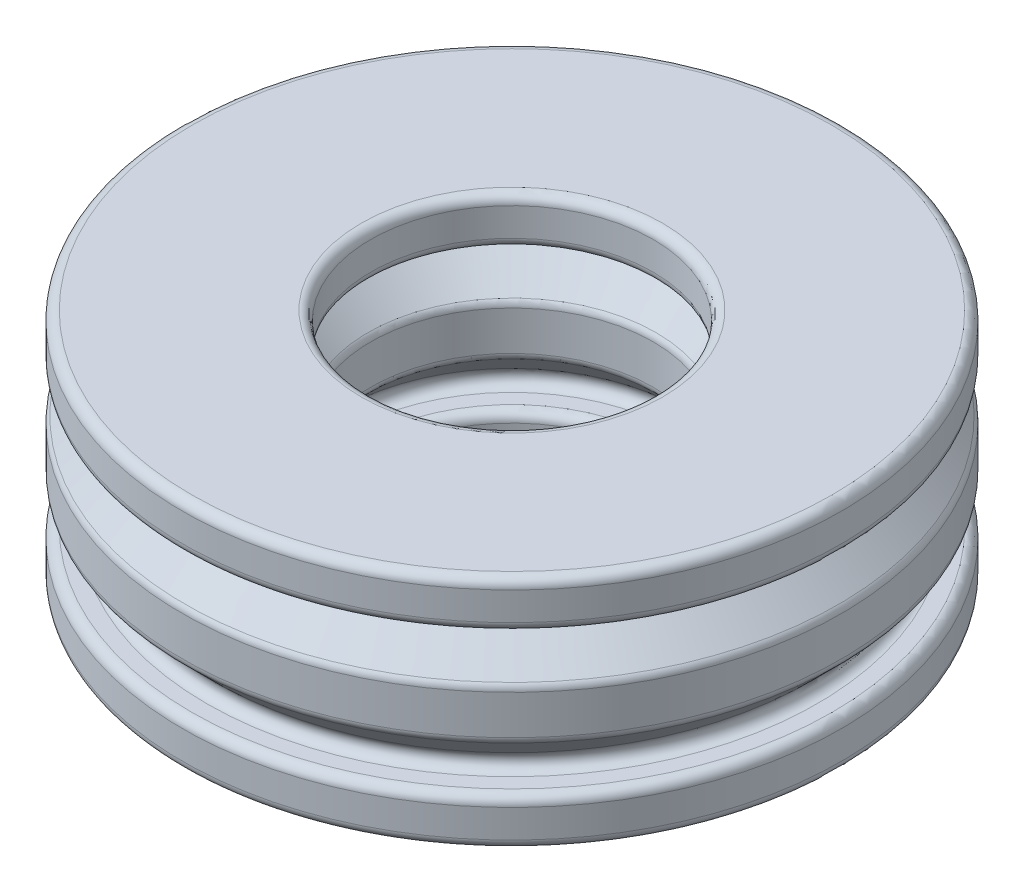
ISO-10303-21;
HEADER;
FILE_DESCRIPTION(('STEP AP214'),'2;1');
FILE_NAME('part.step','',(''),(''),'','','');
FILE_SCHEMA(('AUTOMOTIVE_DESIGN { 1 0 10303 214 1 1 1 1 }'));
ENDSEC;
DATA;
#1=APPLICATION_CONTEXT('core data for automotive mechanical design processes');
#2=APPLICATION_PROTOCOL_DEFINITION('international standard','automotive_design',2000,#1);
#3=PRODUCT_CONTEXT('',#1,'mechanical');
#4=PRODUCT('Part','Part','',(#3));
#5=PRODUCT_RELATED_PRODUCT_CATEGORY('part','',(#4));
#6=PRODUCT_DEFINITION_FORMATION('','',#4);
#7=PRODUCT_DEFINITION_CONTEXT('part definition',#1,'design');
#8=PRODUCT_DEFINITION('design','',#6,#7);
#9=PRODUCT_DEFINITION_SHAPE('','',#8);
#10=(LENGTH_UNIT() NAMED_UNIT(*) SI_UNIT(.MILLI.,.METRE.));
#11=(NAMED_UNIT(*) PLANE_ANGLE_UNIT() SI_UNIT($,.RADIAN.));
#12=(NAMED_UNIT(*) SI_UNIT($,.STERADIAN.) SOLID_ANGLE_UNIT());
#13=UNCERTAINTY_MEASURE_WITH_UNIT(LENGTH_MEASURE(1.E-05),#10,'distance_accuracy_value','');
#14=(GEOMETRIC_REPRESENTATION_CONTEXT(3) GLOBAL_UNCERTAINTY_ASSIGNED_CONTEXT((#13)) GLOBAL_UNIT_ASSIGNED_CONTEXT((#10,
#11,#12)) REPRESENTATION_CONTEXT('',''));
#15=CARTESIAN_POINT('',(0.,0.,0.));
#16=DIRECTION('',(0.,0.,1.));
#17=DIRECTION('',(1.,0.,0.));
#18=AXIS2_PLACEMENT_3D('',#15,#16,#17);
#19=CARTESIAN_POINT('',(0.,2.08284271247461,0.));
#20=DIRECTION('',(0.,-1.,0.));
#21=DIRECTION('',(0.,0.,-1.));
#22=AXIS2_PLACEMENT_3D('',#19,#20,#21);
#23=TOROIDAL_SURFACE('',#22,3.2,0.2);
#24=CARTESIAN_POINT('',(0.,2.08284271247461,0.));
#25=DIRECTION('',(0.,-1.,0.));
#26=DIRECTION('',(0.,0.,-1.));
#27=AXIS2_PLACEMENT_3D('',#24,#25,#26);
#28=CIRCLE('',#27,3.);
#29=CARTESIAN_POINT('',(0.,2.08284271247461,-3.));
#30=VERTEX_POINT('',#29);
#31=EDGE_CURVE('E10',#30,#30,#28,.T.);
#32=ORIENTED_EDGE('',*,*,#31,.F.);
#33=EDGE_LOOP('',(#32));
#34=FACE_BOUND('',#33,.T.);
#35=CARTESIAN_POINT('',(0.,1.9414213562373,0.));
#36=DIRECTION('',(0.,-1.,0.));
#37=DIRECTION('',(0.,0.,-1.));
#38=AXIS2_PLACEMENT_3D('',#35,#36,#37);
#39=CIRCLE('',#38,3.05857864376269);
#40=CARTESIAN_POINT('',(0.,1.9414213562373,-3.05857864376269));
#41=VERTEX_POINT('',#40);
#42=EDGE_CURVE('E134',#41,#41,#39,.T.);
#43=ORIENTED_EDGE('',*,*,#42,.T.);
#44=EDGE_LOOP('',(#43));
#45=FACE_BOUND('',#44,.T.);
#46=ADVANCED_FACE('F34',(#34,#45),#23,.T.);
#47=CARTESIAN_POINT('',(0.,0.,0.));
#48=DIRECTION('',(0.,-1.,0.));
#49=DIRECTION('',(0.,0.,-1.));
#50=AXIS2_PLACEMENT_3D('',#47,#48,#49);
#51=CYLINDRICAL_SURFACE('',#50,3.);
#52=CARTESIAN_POINT('',(0.,2.91715728752539,0.));
#53=DIRECTION('',(0.,-1.,0.));
#54=DIRECTION('',(0.,0.,-1.));
#55=AXIS2_PLACEMENT_3D('',#52,#53,#54);
#56=CIRCLE('',#55,3.);
#57=CARTESIAN_POINT('',(0.,2.91715728752539,-3.));
#58=VERTEX_POINT('',#57);
#59=EDGE_CURVE('E40',#58,#58,#56,.T.);
#60=ORIENTED_EDGE('',*,*,#59,.F.);
#61=EDGE_LOOP('',(#60));
#62=FACE_BOUND('',#61,.T.);
#63=ORIENTED_EDGE('',*,*,#31,.T.);
#64=EDGE_LOOP('',(#63));
#65=FACE_BOUND('',#64,.T.);
#66=ADVANCED_FACE('F315',(#62,#65),#51,.F.);
#67=CARTESIAN_POINT('',(0.,2.91715728752539,0.));
#68=DIRECTION('',(0.,-1.,0.));
#69=DIRECTION('',(0.,0.,-1.));
#70=AXIS2_PLACEMENT_3D('',#67,#68,#69);
#71=TOROIDAL_SURFACE('',#70,3.2,0.2);
#72=CARTESIAN_POINT('',(0.,3.0585786437627,0.));
#73=DIRECTION('',(0.,-1.,0.));
#74=DIRECTION('',(0.,0.,-1.));
#75=AXIS2_PLACEMENT_3D('',#72,#73,#74);
#76=CIRCLE('',#75,3.05857864376269);
#77=CARTESIAN_POINT('',(0.,3.0585786437627,-3.05857864376269));
#78=VERTEX_POINT('',#77);
#79=EDGE_CURVE('E44',#78,#78,#76,.T.);
#80=ORIENTED_EDGE('',*,*,#79,.F.);
#81=EDGE_LOOP('',(#80));
#82=FACE_BOUND('',#81,.T.);
#83=ORIENTED_EDGE('',*,*,#59,.T.);
#84=EDGE_LOOP('',(#83));
#85=FACE_BOUND('',#84,.T.);
#86=ADVANCED_FACE('F310',(#82,#85),#71,.T.);
#87=CARTESIAN_POINT('',(0.,3.0585786437627,0.));
#88=DIRECTION('',(0.,1.,0.));
#89=DIRECTION('',(0.,0.,1.));
#90=AXIS2_PLACEMENT_3D('',#87,#88,#89);
#91=CONICAL_SURFACE('',#90,3.05857864376269,0.785398163397453);
#92=CARTESIAN_POINT('',(0.,3.65857864376269,0.));
#93=DIRECTION('',(0.,-1.,0.));
#94=DIRECTION('',(0.,0.,-1.));
#95=AXIS2_PLACEMENT_3D('',#92,#93,#94);
#96=CIRCLE('',#95,3.65857864376269);
#97=CARTESIAN_POINT('',(0.,3.65857864376269,-3.65857864376269));
#98=VERTEX_POINT('',#97);
#99=EDGE_CURVE('E48',#98,#98,#96,.T.);
#100=ORIENTED_EDGE('',*,*,#99,.F.);
#101=EDGE_LOOP('',(#100));
#102=FACE_BOUND('',#101,.T.);
#103=ORIENTED_EDGE('',*,*,#79,.T.);
#104=EDGE_LOOP('',(#103));
#105=FACE_BOUND('',#104,.T.);
#106=ADVANCED_FACE('F304',(#102,#105),#91,.F.);
#107=CARTESIAN_POINT('',(0.,3.8,0.));
#108=DIRECTION('',(0.,-1.,0.));
#109=DIRECTION('',(0.,0.,-1.));
#110=AXIS2_PLACEMENT_3D('',#107,#108,#109);
#111=TOROIDAL_SURFACE('',#110,3.51715728752538,0.200000000000001);
#112=CARTESIAN_POINT('',(0.,4.,0.));
#113=DIRECTION('',(0.,-1.,0.));
#114=DIRECTION('',(0.,0.,-1.));
#115=AXIS2_PLACEMENT_3D('',#112,#113,#114);
#116=CIRCLE('',#115,3.51715728752538);
#117=CARTESIAN_POINT('',(0.,4.,-3.51715728752538));
#118=VERTEX_POINT('',#117);
#119=EDGE_CURVE('E53',#118,#118,#116,.T.);
#120=ORIENTED_EDGE('',*,*,#119,.F.);
#121=EDGE_LOOP('',(#120));
#122=FACE_BOUND('',#121,.T.);
#123=ORIENTED_EDGE('',*,*,#99,.T.);
#124=EDGE_LOOP('',(#123));
#125=FACE_BOUND('',#124,.T.);
#126=ADVANCED_FACE('F298',(#122,#125),#111,.F.);
#127=CARTESIAN_POINT('',(-3.2,4.,0.));
#128=DIRECTION('',(0.,1.,0.));
#129=DIRECTION('',(0.,0.,1.));
#130=AXIS2_PLACEMENT_3D('',#127,#128,#129);
#131=PLANE('',#130);
#132=CARTESIAN_POINT('',(0.,4.,0.));
#133=DIRECTION('',(0.,-1.,0.));
#134=DIRECTION('',(0.,0.,-1.));
#135=AXIS2_PLACEMENT_3D('',#132,#133,#134);
#136=CIRCLE('',#135,3.2);
#137=CARTESIAN_POINT('',(0.,4.,-3.2));
#138=VERTEX_POINT('',#137);
#139=EDGE_CURVE('E56',#138,#138,#136,.T.);
#140=ORIENTED_EDGE('',*,*,#139,.F.);
#141=EDGE_LOOP('',(#140));
#142=FACE_BOUND('',#141,.T.);
#143=ORIENTED_EDGE('',*,*,#119,.T.);
#144=EDGE_LOOP('',(#143));
#145=FACE_BOUND('',#144,.T.);
#146=ADVANCED_FACE('F292',(#142,#145),#131,.F.);
#147=CARTESIAN_POINT('',(0.,4.2,0.));
#148=DIRECTION('',(0.,-1.,0.));
#149=DIRECTION('',(0.,0.,-1.));
#150=AXIS2_PLACEMENT_3D('',#147,#148,#149);
#151=TOROIDAL_SURFACE('',#150,3.2,0.2);
#152=CARTESIAN_POINT('',(0.,4.2,0.));
#153=DIRECTION('',(0.,-1.,0.));
#154=DIRECTION('',(0.,0.,-1.));
#155=AXIS2_PLACEMENT_3D('',#152,#153,#154);
#156=CIRCLE('',#155,3.);
#157=CARTESIAN_POINT('',(0.,4.2,-3.));
#158=VERTEX_POINT('',#157);
#159=EDGE_CURVE('E59',#158,#158,#156,.T.);
#160=ORIENTED_EDGE('',*,*,#159,.F.);
#161=EDGE_LOOP('',(#160));
#162=FACE_BOUND('',#161,.T.);
#163=ORIENTED_EDGE('',*,*,#139,.T.);
#164=EDGE_LOOP('',(#163));
#165=FACE_BOUND('',#164,.T.);
#166=ADVANCED_FACE('F286',(#162,#165),#151,.T.);
#167=CARTESIAN_POINT('',(0.,0.,0.));
#168=DIRECTION('',(0.,-1.,0.));
#169=DIRECTION('',(0.,0.,-1.));
#170=AXIS2_PLACEMENT_3D('',#167,#168,#169);
#171=CYLINDRICAL_SURFACE('',#170,3.);
#172=CARTESIAN_POINT('',(0.,4.8,0.));
#173=DIRECTION('',(0.,-1.,0.));
#174=DIRECTION('',(0.,0.,-1.));
#175=AXIS2_PLACEMENT_3D('',#172,#173,#174);
#176=CIRCLE('',#175,3.);
#177=CARTESIAN_POINT('',(0.,4.8,-3.));
#178=VERTEX_POINT('',#177);
#179=EDGE_CURVE('E62',#178,#178,#176,.T.);
#180=ORIENTED_EDGE('',*,*,#179,.F.);
#181=EDGE_LOOP('',(#180));
#182=FACE_BOUND('',#181,.T.);
#183=ORIENTED_EDGE('',*,*,#159,.T.);
#184=EDGE_LOOP('',(#183));
#185=FACE_BOUND('',#184,.T.);
#186=ADVANCED_FACE('F280',(#182,#185),#171,.F.);
#187=CARTESIAN_POINT('',(0.,4.8,0.));
#188=DIRECTION('',(0.,-1.,0.));
#189=DIRECTION('',(0.,0.,-1.));
#190=AXIS2_PLACEMENT_3D('',#187,#188,#189);
#191=TOROIDAL_SURFACE('',#190,3.2,0.2);
#192=CARTESIAN_POINT('',(0.,5.,0.));
#193=DIRECTION('',(0.,-1.,0.));
#194=DIRECTION('',(0.,0.,-1.));
#195=AXIS2_PLACEMENT_3D('',#192,#193,#194);
#196=CIRCLE('',#195,3.2);
#197=CARTESIAN_POINT('',(0.,5.,-3.2));
#198=VERTEX_POINT('',#197);
#199=EDGE_CURVE('E65',#198,#198,#196,.T.);
#200=ORIENTED_EDGE('',*,*,#199,.F.);
#201=EDGE_LOOP('',(#200));
#202=FACE_BOUND('',#201,.T.);
#203=ORIENTED_EDGE('',*,*,#179,.T.);
#204=EDGE_LOOP('',(#203));
#205=FACE_BOUND('',#204,.T.);
#206=ADVANCED_FACE('F274',(#202,#205),#191,.T.);
#207=CARTESIAN_POINT('',(-3.2,5.,0.));
#208=DIRECTION('',(0.,-1.,0.));
#209=DIRECTION('',(0.,0.,-1.));
#210=AXIS2_PLACEMENT_3D('',#207,#208,#209);
#211=PLANE('',#210);
#212=CARTESIAN_POINT('',(0.,5.,0.));
#213=DIRECTION('',(0.,-1.,0.));
#214=DIRECTION('',(0.,0.,-1.));
#215=AXIS2_PLACEMENT_3D('',#212,#213,#214);
#216=CIRCLE('',#215,6.8);
#217=CARTESIAN_POINT('',(0.,5.,-6.8));
#218=VERTEX_POINT('',#217);
#219=EDGE_CURVE('E68',#218,#218,#216,.T.);
#220=ORIENTED_EDGE('',*,*,#219,.F.);
#221=EDGE_LOOP('',(#220));
#222=FACE_BOUND('',#221,.T.);
#223=ORIENTED_EDGE('',*,*,#199,.T.);
#224=EDGE_LOOP('',(#223));
#225=FACE_BOUND('',#224,.T.);
#226=ADVANCED_FACE('F268',(#222,#225),#211,.F.);
#227=CARTESIAN_POINT('',(0.,4.8,0.));
#228=DIRECTION('',(0.,-1.,0.));
#229=DIRECTION('',(0.,0.,-1.));
#230=AXIS2_PLACEMENT_3D('',#227,#228,#229);
#231=TOROIDAL_SURFACE('',#230,6.8,0.2);
#232=CARTESIAN_POINT('',(0.,4.8,0.));
#233=DIRECTION('',(0.,-1.,0.));
#234=DIRECTION('',(0.,0.,-1.));
#235=AXIS2_PLACEMENT_3D('',#232,#233,#234);
#236=CIRCLE('',#235,7.);
#237=CARTESIAN_POINT('',(0.,4.8,-7.));
#238=VERTEX_POINT('',#237);
#239=EDGE_CURVE('E71',#238,#238,#236,.T.);
#240=ORIENTED_EDGE('',*,*,#239,.F.);
#241=EDGE_LOOP('',(#240));
#242=FACE_BOUND('',#241,.T.);
#243=ORIENTED_EDGE('',*,*,#219,.T.);
#244=EDGE_LOOP('',(#243));
#245=FACE_BOUND('',#244,.T.);
#246=ADVANCED_FACE('F262',(#242,#245),#231,.T.);
#247=CARTESIAN_POINT('',(0.,0.,0.));
#248=DIRECTION('',(0.,-1.,0.));
#249=DIRECTION('',(0.,0.,-1.));
#250=AXIS2_PLACEMENT_3D('',#247,#248,#249);
#251=CYLINDRICAL_SURFACE('',#250,7.);
#252=CARTESIAN_POINT('',(0.,4.2,0.));
#253=DIRECTION('',(0.,-1.,0.));
#254=DIRECTION('',(0.,0.,-1.));
#255=AXIS2_PLACEMENT_3D('',#252,#253,#254);
#256=CIRCLE('',#255,7.);
#257=CARTESIAN_POINT('',(0.,4.2,-7.));
#258=VERTEX_POINT('',#257);
#259=EDGE_CURVE('E74',#258,#258,#256,.T.);
#260=ORIENTED_EDGE('',*,*,#259,.F.);
#261=EDGE_LOOP('',(#260));
#262=FACE_BOUND('',#261,.T.);
#263=ORIENTED_EDGE('',*,*,#239,.T.);
#264=EDGE_LOOP('',(#263));
#265=FACE_BOUND('',#264,.T.);
#266=ADVANCED_FACE('F256',(#262,#265),#251,.T.);
#267=CARTESIAN_POINT('',(0.,4.2,0.));
#268=DIRECTION('',(0.,-1.,0.));
#269=DIRECTION('',(0.,0.,-1.));
#270=AXIS2_PLACEMENT_3D('',#267,#268,#269);
#271=TOROIDAL_SURFACE('',#270,6.8,0.2);
#272=CARTESIAN_POINT('',(0.,4.,0.));
#273=DIRECTION('',(0.,-1.,0.));
#274=DIRECTION('',(0.,0.,-1.));
#275=AXIS2_PLACEMENT_3D('',#272,#273,#274);
#276=CIRCLE('',#275,6.8);
#277=CARTESIAN_POINT('',(0.,4.,-6.8));
#278=VERTEX_POINT('',#277);
#279=EDGE_CURVE('E77',#278,#278,#276,.T.);
#280=ORIENTED_EDGE('',*,*,#279,.F.);
#281=EDGE_LOOP('',(#280));
#282=FACE_BOUND('',#281,.T.);
#283=ORIENTED_EDGE('',*,*,#259,.T.);
#284=EDGE_LOOP('',(#283));
#285=FACE_BOUND('',#284,.T.);
#286=ADVANCED_FACE('F250',(#282,#285),#271,.T.);
#287=CARTESIAN_POINT('',(-6.8,4.,0.));
#288=DIRECTION('',(0.,1.,0.));
#289=DIRECTION('',(0.,0.,1.));
#290=AXIS2_PLACEMENT_3D('',#287,#288,#289);
#291=PLANE('',#290);
#292=CARTESIAN_POINT('',(0.,4.,0.));
#293=DIRECTION('',(0.,-1.,0.));
#294=DIRECTION('',(0.,0.,-1.));
#295=AXIS2_PLACEMENT_3D('',#292,#293,#294);
#296=CIRCLE('',#295,6.48284271247462);
#297=CARTESIAN_POINT('',(0.,4.,-6.48284271247462));
#298=VERTEX_POINT('',#297);
#299=EDGE_CURVE('E80',#298,#298,#296,.T.);
#300=ORIENTED_EDGE('',*,*,#299,.F.);
#301=EDGE_LOOP('',(#300));
#302=FACE_BOUND('',#301,.T.);
#303=ORIENTED_EDGE('',*,*,#279,.T.);
#304=EDGE_LOOP('',(#303));
#305=FACE_BOUND('',#304,.T.);
#306=ADVANCED_FACE('F244',(#302,#305),#291,.F.);
#307=CARTESIAN_POINT('',(0.,3.8,0.));
#308=DIRECTION('',(0.,-1.,0.));
#309=DIRECTION('',(0.,0.,-1.));
#310=AXIS2_PLACEMENT_3D('',#307,#308,#309);
#311=TOROIDAL_SURFACE('',#310,6.48284271247462,0.2);
#312=CARTESIAN_POINT('',(0.,3.65857864376269,0.));
#313=DIRECTION('',(0.,-1.,0.));
#314=DIRECTION('',(0.,0.,-1.));
#315=AXIS2_PLACEMENT_3D('',#312,#313,#314);
#316=CIRCLE('',#315,6.34142135623731);
#317=CARTESIAN_POINT('',(0.,3.65857864376269,-6.34142135623731));
#318=VERTEX_POINT('',#317);
#319=EDGE_CURVE('E83',#318,#318,#316,.T.);
#320=ORIENTED_EDGE('',*,*,#319,.F.);
#321=EDGE_LOOP('',(#320));
#322=FACE_BOUND('',#321,.T.);
#323=ORIENTED_EDGE('',*,*,#299,.T.);
#324=EDGE_LOOP('',(#323));
#325=FACE_BOUND('',#324,.T.);
#326=ADVANCED_FACE('F238',(#322,#325),#311,.F.);
#327=CARTESIAN_POINT('',(0.,3.65857864376269,0.));
#328=DIRECTION('',(0.,-1.,0.));
#329=DIRECTION('',(0.,0.,-1.));
#330=AXIS2_PLACEMENT_3D('',#327,#328,#329);
#331=CONICAL_SURFACE('',#330,6.34142135623731,0.785398163397453);
#332=CARTESIAN_POINT('',(0.,3.0585786437627,0.));
#333=DIRECTION('',(0.,-1.,0.));
#334=DIRECTION('',(0.,0.,-1.));
#335=AXIS2_PLACEMENT_3D('',#332,#333,#334);
#336=CIRCLE('',#335,6.94142135623731);
#337=CARTESIAN_POINT('',(0.,3.0585786437627,-6.94142135623731));
#338=VERTEX_POINT('',#337);
#339=EDGE_CURVE('E86',#338,#338,#336,.T.);
#340=ORIENTED_EDGE('',*,*,#339,.F.);
#341=EDGE_LOOP('',(#340));
#342=FACE_BOUND('',#341,.T.);
#343=ORIENTED_EDGE('',*,*,#319,.T.);
#344=EDGE_LOOP('',(#343));
#345=FACE_BOUND('',#344,.T.);
#346=ADVANCED_FACE('F232',(#342,#345),#331,.T.);
#347=CARTESIAN_POINT('',(0.,2.91715728752539,0.));
#348=DIRECTION('',(0.,-1.,0.));
#349=DIRECTION('',(0.,0.,-1.));
#350=AXIS2_PLACEMENT_3D('',#347,#348,#349);
#351=TOROIDAL_SURFACE('',#350,6.8,0.2);
#352=CARTESIAN_POINT('',(0.,2.91715728752539,0.));
#353=DIRECTION('',(0.,-1.,0.));
#354=DIRECTION('',(0.,0.,-1.));
#355=AXIS2_PLACEMENT_3D('',#352,#353,#354);
#356=CIRCLE('',#355,7.);
#357=CARTESIAN_POINT('',(0.,2.91715728752539,-7.));
#358=VERTEX_POINT('',#357);
#359=EDGE_CURVE('E89',#358,#358,#356,.T.);
#360=ORIENTED_EDGE('',*,*,#359,.F.);
#361=EDGE_LOOP('',(#360));
#362=FACE_BOUND('',#361,.T.);
#363=ORIENTED_EDGE('',*,*,#339,.T.);
#364=EDGE_LOOP('',(#363));
#365=FACE_BOUND('',#364,.T.);
#366=ADVANCED_FACE('F226',(#362,#365),#351,.T.);
#367=CARTESIAN_POINT('',(0.,0.,0.));
#368=DIRECTION('',(0.,-1.,0.));
#369=DIRECTION('',(0.,0.,-1.));
#370=AXIS2_PLACEMENT_3D('',#367,#368,#369);
#371=CYLINDRICAL_SURFACE('',#370,7.);
#372=CARTESIAN_POINT('',(0.,2.08284271247461,0.));
#373=DIRECTION('',(0.,-1.,0.));
#374=DIRECTION('',(0.,0.,-1.));
#375=AXIS2_PLACEMENT_3D('',#372,#373,#374);
#376=CIRCLE('',#375,7.);
#377=CARTESIAN_POINT('',(0.,2.08284271247461,-7.));
#378=VERTEX_POINT('',#377);
#379=EDGE_CURVE('E92',#378,#378,#376,.T.);
#380=ORIENTED_EDGE('',*,*,#379,.F.);
#381=EDGE_LOOP('',(#380));
#382=FACE_BOUND('',#381,.T.);
#383=ORIENTED_EDGE('',*,*,#359,.T.);
#384=EDGE_LOOP('',(#383));
#385=FACE_BOUND('',#384,.T.);
#386=ADVANCED_FACE('F220',(#382,#385),#371,.T.);
#387=CARTESIAN_POINT('',(0.,2.08284271247461,0.));
#388=DIRECTION('',(0.,-1.,0.));
#389=DIRECTION('',(0.,0.,-1.));
#390=AXIS2_PLACEMENT_3D('',#387,#388,#389);
#391=TOROIDAL_SURFACE('',#390,6.8,0.199999999999999);
#392=CARTESIAN_POINT('',(0.,1.9414213562373,0.));
#393=DIRECTION('',(0.,-1.,0.));
#394=DIRECTION('',(0.,0.,-1.));
#395=AXIS2_PLACEMENT_3D('',#392,#393,#394);
#396=CIRCLE('',#395,6.94142135623731);
#397=CARTESIAN_POINT('',(0.,1.9414213562373,-6.94142135623731));
#398=VERTEX_POINT('',#397);
#399=EDGE_CURVE('E95',#398,#398,#396,.T.);
#400=ORIENTED_EDGE('',*,*,#399,.F.);
#401=EDGE_LOOP('',(#400));
#402=FACE_BOUND('',#401,.T.);
#403=ORIENTED_EDGE('',*,*,#379,.T.);
#404=EDGE_LOOP('',(#403));
#405=FACE_BOUND('',#404,.T.);
#406=ADVANCED_FACE('F214',(#402,#405),#391,.T.);
#407=CARTESIAN_POINT('',(0.,1.9414213562373,0.));
#408=DIRECTION('',(0.,1.,0.));
#409=DIRECTION('',(0.,0.,1.));
#410=AXIS2_PLACEMENT_3D('',#407,#408,#409);
#411=CONICAL_SURFACE('',#410,6.94142135623731,0.785398163397456);
#412=CARTESIAN_POINT('',(0.,1.34142135623731,0.));
#413=DIRECTION('',(0.,-1.,0.));
#414=DIRECTION('',(0.,0.,-1.));
#415=AXIS2_PLACEMENT_3D('',#412,#413,#414);
#416=CIRCLE('',#415,6.34142135623731);
#417=CARTESIAN_POINT('',(0.,1.34142135623731,-6.34142135623731));
#418=VERTEX_POINT('',#417);
#419=EDGE_CURVE('E98',#418,#418,#416,.T.);
#420=ORIENTED_EDGE('',*,*,#419,.F.);
#421=EDGE_LOOP('',(#420));
#422=FACE_BOUND('',#421,.T.);
#423=ORIENTED_EDGE('',*,*,#399,.T.);
#424=EDGE_LOOP('',(#423));
#425=FACE_BOUND('',#424,.T.);
#426=ADVANCED_FACE('F208',(#422,#425),#411,.T.);
#427=CARTESIAN_POINT('',(0.,1.2,0.));
#428=DIRECTION('',(0.,-1.,0.));
#429=DIRECTION('',(0.,0.,-1.));
#430=AXIS2_PLACEMENT_3D('',#427,#428,#429);
#431=TOROIDAL_SURFACE('',#430,6.48284271247462,0.200000000000001);
#432=CARTESIAN_POINT('',(0.,1.,0.));
#433=DIRECTION('',(0.,-1.,0.));
#434=DIRECTION('',(0.,0.,-1.));
#435=AXIS2_PLACEMENT_3D('',#432,#433,#434);
#436=CIRCLE('',#435,6.48284271247462);
#437=CARTESIAN_POINT('',(0.,1.,-6.48284271247462));
#438=VERTEX_POINT('',#437);
#439=EDGE_CURVE('E101',#438,#438,#436,.T.);
#440=ORIENTED_EDGE('',*,*,#439,.F.);
#441=EDGE_LOOP('',(#440));
#442=FACE_BOUND('',#441,.T.);
#443=ORIENTED_EDGE('',*,*,#419,.T.);
#444=EDGE_LOOP('',(#443));
#445=FACE_BOUND('',#444,.T.);
#446=ADVANCED_FACE('F202',(#442,#445),#431,.F.);
#447=CARTESIAN_POINT('',(-6.48284271247462,1.,0.));
#448=DIRECTION('',(0.,-1.,0.));
#449=DIRECTION('',(0.,0.,-1.));
#450=AXIS2_PLACEMENT_3D('',#447,#448,#449);
#451=PLANE('',#450);
#452=CARTESIAN_POINT('',(0.,1.,0.));
#453=DIRECTION('',(0.,-1.,0.));
#454=DIRECTION('',(0.,0.,-1.));
#455=AXIS2_PLACEMENT_3D('',#452,#453,#454);
#456=CIRCLE('',#455,6.8);
#457=CARTESIAN_POINT('',(0.,1.,-6.8));
#458=VERTEX_POINT('',#457);
#459=EDGE_CURVE('E104',#458,#458,#456,.T.);
#460=ORIENTED_EDGE('',*,*,#459,.F.);
#461=EDGE_LOOP('',(#460));
#462=FACE_BOUND('',#461,.T.);
#463=ORIENTED_EDGE('',*,*,#439,.T.);
#464=EDGE_LOOP('',(#463));
#465=FACE_BOUND('',#464,.T.);
#466=ADVANCED_FACE('F196',(#462,#465),#451,.F.);
#467=CARTESIAN_POINT('',(0.,0.8,0.));
#468=DIRECTION('',(0.,-1.,0.));
#469=DIRECTION('',(0.,0.,-1.));
#470=AXIS2_PLACEMENT_3D('',#467,#468,#469);
#471=TOROIDAL_SURFACE('',#470,6.8,0.2);
#472=CARTESIAN_POINT('',(0.,0.799999999999998,0.));
#473=DIRECTION('',(0.,-1.,0.));
#474=DIRECTION('',(0.,0.,-1.));
#475=AXIS2_PLACEMENT_3D('',#472,#473,#474);
#476=CIRCLE('',#475,7.);
#477=CARTESIAN_POINT('',(0.,0.799999999999998,-7.));
#478=VERTEX_POINT('',#477);
#479=EDGE_CURVE('E107',#478,#478,#476,.T.);
#480=ORIENTED_EDGE('',*,*,#479,.F.);
#481=EDGE_LOOP('',(#480));
#482=FACE_BOUND('',#481,.T.);
#483=ORIENTED_EDGE('',*,*,#459,.T.);
#484=EDGE_LOOP('',(#483));
#485=FACE_BOUND('',#484,.T.);
#486=ADVANCED_FACE('F190',(#482,#485),#471,.T.);
#487=CARTESIAN_POINT('',(0.,0.,0.));
#488=DIRECTION('',(0.,-1.,0.));
#489=DIRECTION('',(0.,0.,-1.));
#490=AXIS2_PLACEMENT_3D('',#487,#488,#489);
#491=CYLINDRICAL_SURFACE('',#490,7.);
#492=CARTESIAN_POINT('',(0.,0.200000000000001,0.));
#493=DIRECTION('',(0.,-1.,0.));
#494=DIRECTION('',(0.,0.,-1.));
#495=AXIS2_PLACEMENT_3D('',#492,#493,#494);
#496=CIRCLE('',#495,7.);
#497=CARTESIAN_POINT('',(0.,0.200000000000001,-7.));
#498=VERTEX_POINT('',#497);
#499=EDGE_CURVE('E110',#498,#498,#496,.T.);
#500=ORIENTED_EDGE('',*,*,#499,.F.);
#501=EDGE_LOOP('',(#500));
#502=FACE_BOUND('',#501,.T.);
#503=ORIENTED_EDGE('',*,*,#479,.T.);
#504=EDGE_LOOP('',(#503));
#505=FACE_BOUND('',#504,.T.);
#506=ADVANCED_FACE('F184',(#502,#505),#491,.T.);
#507=CARTESIAN_POINT('',(0.,0.2,0.));
#508=DIRECTION('',(0.,-1.,0.));
#509=DIRECTION('',(0.,0.,-1.));
#510=AXIS2_PLACEMENT_3D('',#507,#508,#509);
#511=TOROIDAL_SURFACE('',#510,6.8,0.2);
#512=CARTESIAN_POINT('',(0.,0.,0.));
#513=DIRECTION('',(0.,-1.,0.));
#514=DIRECTION('',(0.,0.,-1.));
#515=AXIS2_PLACEMENT_3D('',#512,#513,#514);
#516=CIRCLE('',#515,6.8);
#517=CARTESIAN_POINT('',(0.,0.,-6.8));
#518=VERTEX_POINT('',#517);
#519=EDGE_CURVE('E113',#518,#518,#516,.T.);
#520=ORIENTED_EDGE('',*,*,#519,.F.);
#521=EDGE_LOOP('',(#520));
#522=FACE_BOUND('',#521,.T.);
#523=ORIENTED_EDGE('',*,*,#499,.T.);
#524=EDGE_LOOP('',(#523));
#525=FACE_BOUND('',#524,.T.);
#526=ADVANCED_FACE('F178',(#522,#525),#511,.T.);
#527=CARTESIAN_POINT('',(-6.8,0.,0.));
#528=DIRECTION('',(0.,1.,0.));
#529=DIRECTION('',(0.,0.,1.));
#530=AXIS2_PLACEMENT_3D('',#527,#528,#529);
#531=PLANE('',#530);
#532=CARTESIAN_POINT('',(0.,0.,0.));
#533=DIRECTION('',(0.,-1.,0.));
#534=DIRECTION('',(0.,0.,-1.));
#535=AXIS2_PLACEMENT_3D('',#532,#533,#534);
#536=CIRCLE('',#535,3.2);
#537=CARTESIAN_POINT('',(0.,0.,-3.2));
#538=VERTEX_POINT('',#537);
#539=EDGE_CURVE('E116',#538,#538,#536,.T.);
#540=ORIENTED_EDGE('',*,*,#539,.F.);
#541=EDGE_LOOP('',(#540));
#542=FACE_BOUND('',#541,.T.);
#543=ORIENTED_EDGE('',*,*,#519,.T.);
#544=EDGE_LOOP('',(#543));
#545=FACE_BOUND('',#544,.T.);
#546=ADVANCED_FACE('F172',(#542,#545),#531,.F.);
#547=CARTESIAN_POINT('',(0.,0.2,0.));
#548=DIRECTION('',(0.,-1.,0.));
#549=DIRECTION('',(0.,0.,-1.));
#550=AXIS2_PLACEMENT_3D('',#547,#548,#549);
#551=TOROIDAL_SURFACE('',#550,3.2,0.2);
#552=CARTESIAN_POINT('',(0.,0.200000000000001,0.));
#553=DIRECTION('',(0.,-1.,0.));
#554=DIRECTION('',(0.,0.,-1.));
#555=AXIS2_PLACEMENT_3D('',#552,#553,#554);
#556=CIRCLE('',#555,3.);
#557=CARTESIAN_POINT('',(0.,0.200000000000001,-3.));
#558=VERTEX_POINT('',#557);
#559=EDGE_CURVE('E119',#558,#558,#556,.T.);
#560=ORIENTED_EDGE('',*,*,#559,.F.);
#561=EDGE_LOOP('',(#560));
#562=FACE_BOUND('',#561,.T.);
#563=ORIENTED_EDGE('',*,*,#539,.T.);
#564=EDGE_LOOP('',(#563));
#565=FACE_BOUND('',#564,.T.);
#566=ADVANCED_FACE('F166',(#562,#565),#551,.T.);
#567=CARTESIAN_POINT('',(0.,0.,0.));
#568=DIRECTION('',(0.,-1.,0.));
#569=DIRECTION('',(0.,0.,-1.));
#570=AXIS2_PLACEMENT_3D('',#567,#568,#569);
#571=CYLINDRICAL_SURFACE('',#570,3.);
#572=CARTESIAN_POINT('',(0.,0.799999999999999,0.));
#573=DIRECTION('',(0.,-1.,0.));
#574=DIRECTION('',(0.,0.,-1.));
#575=AXIS2_PLACEMENT_3D('',#572,#573,#574);
#576=CIRCLE('',#575,3.);
#577=CARTESIAN_POINT('',(0.,0.799999999999999,-3.));
#578=VERTEX_POINT('',#577);
#579=EDGE_CURVE('E122',#578,#578,#576,.T.);
#580=ORIENTED_EDGE('',*,*,#579,.F.);
#581=EDGE_LOOP('',(#580));
#582=FACE_BOUND('',#581,.T.);
#583=ORIENTED_EDGE('',*,*,#559,.T.);
#584=EDGE_LOOP('',(#583));
#585=FACE_BOUND('',#584,.T.);
#586=ADVANCED_FACE('F160',(#582,#585),#571,.F.);
#587=CARTESIAN_POINT('',(0.,0.8,0.));
#588=DIRECTION('',(0.,-1.,0.));
#589=DIRECTION('',(0.,0.,-1.));
#590=AXIS2_PLACEMENT_3D('',#587,#588,#589);
#591=TOROIDAL_SURFACE('',#590,3.2,0.2);
#592=CARTESIAN_POINT('',(0.,1.,0.));
#593=DIRECTION('',(0.,-1.,0.));
#594=DIRECTION('',(0.,0.,-1.));
#595=AXIS2_PLACEMENT_3D('',#592,#593,#594);
#596=CIRCLE('',#595,3.2);
#597=CARTESIAN_POINT('',(0.,1.,-3.2));
#598=VERTEX_POINT('',#597);
#599=EDGE_CURVE('E125',#598,#598,#596,.T.);
#600=ORIENTED_EDGE('',*,*,#599,.F.);
#601=EDGE_LOOP('',(#600));
#602=FACE_BOUND('',#601,.T.);
#603=ORIENTED_EDGE('',*,*,#579,.T.);
#604=EDGE_LOOP('',(#603));
#605=FACE_BOUND('',#604,.T.);
#606=ADVANCED_FACE('F154',(#602,#605),#591,.T.);
#607=CARTESIAN_POINT('',(-3.2,1.,0.));
#608=DIRECTION('',(0.,-1.,0.));
#609=DIRECTION('',(0.,0.,-1.));
#610=AXIS2_PLACEMENT_3D('',#607,#608,#609);
#611=PLANE('',#610);
#612=CARTESIAN_POINT('',(0.,1.,0.));
#613=DIRECTION('',(0.,-1.,0.));
#614=DIRECTION('',(0.,0.,-1.));
#615=AXIS2_PLACEMENT_3D('',#612,#613,#614);
#616=CIRCLE('',#615,3.51715728752538);
#617=CARTESIAN_POINT('',(0.,1.,-3.51715728752538));
#618=VERTEX_POINT('',#617);
#619=EDGE_CURVE('E128',#618,#618,#616,.T.);
#620=ORIENTED_EDGE('',*,*,#619,.F.);
#621=EDGE_LOOP('',(#620));
#622=FACE_BOUND('',#621,.T.);
#623=ORIENTED_EDGE('',*,*,#599,.T.);
#624=EDGE_LOOP('',(#623));
#625=FACE_BOUND('',#624,.T.);
#626=ADVANCED_FACE('F148',(#622,#625),#611,.F.);
#627=CARTESIAN_POINT('',(0.,1.2,0.));
#628=DIRECTION('',(0.,-1.,0.));
#629=DIRECTION('',(0.,0.,-1.));
#630=AXIS2_PLACEMENT_3D('',#627,#628,#629);
#631=TOROIDAL_SURFACE('',#630,3.51715728752538,0.2);
#632=CARTESIAN_POINT('',(0.,1.34142135623731,0.));
#633=DIRECTION('',(0.,-1.,0.));
#634=DIRECTION('',(0.,0.,-1.));
#635=AXIS2_PLACEMENT_3D('',#632,#633,#634);
#636=CIRCLE('',#635,3.65857864376269);
#637=CARTESIAN_POINT('',(0.,1.34142135623731,-3.65857864376269));
#638=VERTEX_POINT('',#637);
#639=EDGE_CURVE('E131',#638,#638,#636,.T.);
#640=ORIENTED_EDGE('',*,*,#639,.F.);
#641=EDGE_LOOP('',(#640));
#642=FACE_BOUND('',#641,.T.);
#643=ORIENTED_EDGE('',*,*,#619,.T.);
#644=EDGE_LOOP('',(#643));
#645=FACE_BOUND('',#644,.T.);
#646=ADVANCED_FACE('F142',(#642,#645),#631,.F.);
#647=CARTESIAN_POINT('',(0.,1.34142135623731,0.));
#648=DIRECTION('',(0.,-1.,0.));
#649=DIRECTION('',(0.,0.,-1.));
#650=AXIS2_PLACEMENT_3D('',#647,#648,#649);
#651=CONICAL_SURFACE('',#650,3.65857864376269,0.785398163397453);
#652=ORIENTED_EDGE('',*,*,#42,.F.);
#653=EDGE_LOOP('',(#652));
#654=FACE_BOUND('',#653,.T.);
#655=ORIENTED_EDGE('',*,*,#639,.T.);
#656=EDGE_LOOP('',(#655));
#657=FACE_BOUND('',#656,.T.);
#658=ADVANCED_FACE('F139',(#654,#657),#651,.F.);
#659=CLOSED_SHELL('',(#46,#66,#86,#106,#126,#146,#166,#186,#206,#226,#246,#266,#286,#306,#326,
#346,#366,#386,#406,#426,#446,#466,#486,#506,#526,#546,#566,#586,#606,#626,#646,#658));
#660=MANIFOLD_SOLID_BREP('B2',#659);
#661=ADVANCED_BREP_SHAPE_REPRESENTATION('',(#18,#660),#14);
#662=SHAPE_DEFINITION_REPRESENTATION(#9,#661);
ENDSEC;
END-ISO-10303-21;
